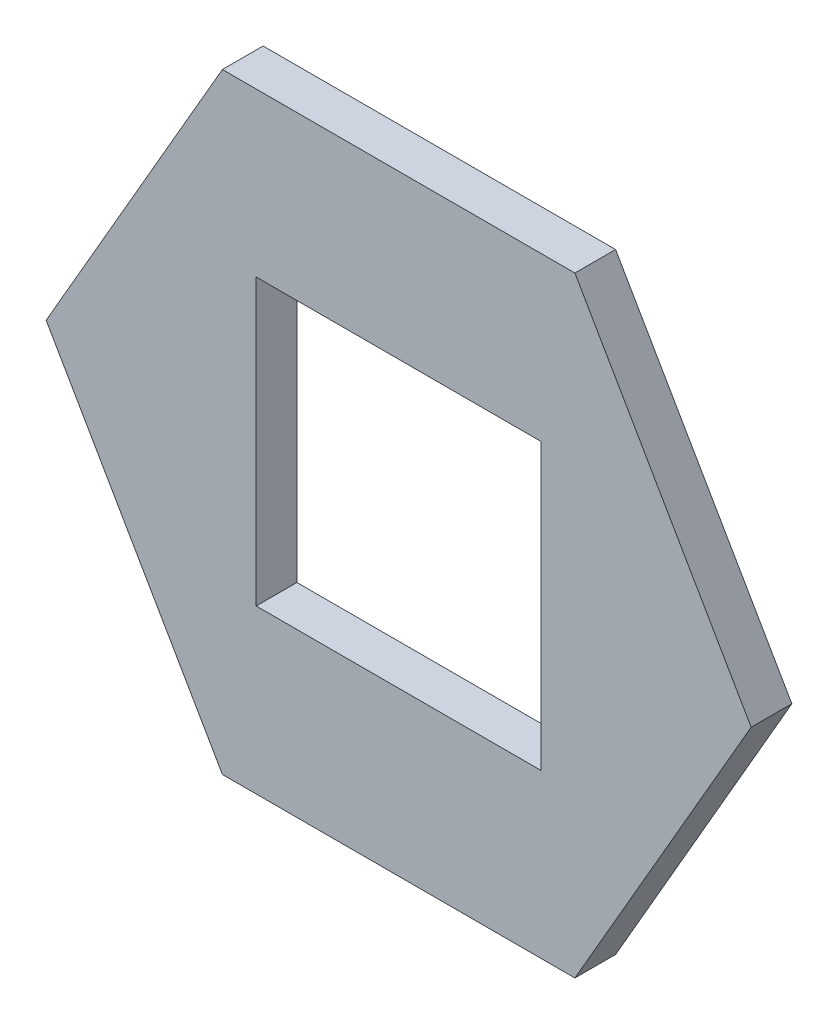
ISO-10303-21;
HEADER;
FILE_DESCRIPTION(('STEP AP214'),'2;1');
FILE_NAME('part.step','',(''),(''),'','','');
FILE_SCHEMA(('AUTOMOTIVE_DESIGN { 1 0 10303 214 1 1 1 1 }'));
ENDSEC;
DATA;
#1=APPLICATION_CONTEXT('core data for automotive mechanical design processes');
#2=APPLICATION_PROTOCOL_DEFINITION('international standard','automotive_design',2000,#1);
#3=PRODUCT_CONTEXT('',#1,'mechanical');
#4=PRODUCT('Part','Part','',(#3));
#5=PRODUCT_RELATED_PRODUCT_CATEGORY('part','',(#4));
#6=PRODUCT_DEFINITION_FORMATION('','',#4);
#7=PRODUCT_DEFINITION_CONTEXT('part definition',#1,'design');
#8=PRODUCT_DEFINITION('design','',#6,#7);
#9=PRODUCT_DEFINITION_SHAPE('','',#8);
#10=(LENGTH_UNIT() NAMED_UNIT(*) SI_UNIT(.MILLI.,.METRE.));
#11=(NAMED_UNIT(*) PLANE_ANGLE_UNIT() SI_UNIT($,.RADIAN.));
#12=(NAMED_UNIT(*) SI_UNIT($,.STERADIAN.) SOLID_ANGLE_UNIT());
#13=UNCERTAINTY_MEASURE_WITH_UNIT(LENGTH_MEASURE(1.E-05),#10,'distance_accuracy_value','');
#14=(GEOMETRIC_REPRESENTATION_CONTEXT(3) GLOBAL_UNCERTAINTY_ASSIGNED_CONTEXT((#13)) GLOBAL_UNIT_ASSIGNED_CONTEXT((#10,
#11,#12)) REPRESENTATION_CONTEXT('',''));
#15=CARTESIAN_POINT('',(0.,0.,0.));
#16=DIRECTION('',(0.,0.,1.));
#17=DIRECTION('',(1.,0.,0.));
#18=AXIS2_PLACEMENT_3D('',#15,#16,#17);
#19=CARTESIAN_POINT('',(43.3012701892221,-74.9999999999995,10.));
#20=DIRECTION('',(-0.866025403784441,0.499999999999996,0.));
#21=DIRECTION('',(-0.499999999999996,-0.866025403784441,0.));
#22=AXIS2_PLACEMENT_3D('',#19,#20,#21);
#23=PLANE('',#22);
#24=DIRECTION('',(0.499999999999996,0.866025403784441,0.));
#25=VECTOR('',#24,1.);
#26=CARTESIAN_POINT('',(43.3012701892221,-74.9999999999995,0.));
#27=LINE('',#26,#25);
#28=CARTESIAN_POINT('',(43.3012701892221,-74.9999999999995,0.));
#29=VERTEX_POINT('',#28);
#30=CARTESIAN_POINT('',(86.6025403784436,4.44645680446325E-13,0.));
#31=VERTEX_POINT('',#30);
#32=EDGE_CURVE('E147',#29,#31,#27,.T.);
#33=ORIENTED_EDGE('',*,*,#32,.T.);
#34=DIRECTION('',(0.,0.,-1.));
#35=VECTOR('',#34,1.);
#36=CARTESIAN_POINT('',(86.6025403784436,4.44645680446325E-13,10.));
#37=LINE('',#36,#35);
#38=CARTESIAN_POINT('',(86.6025403784436,4.44645680446325E-13,10.));
#39=VERTEX_POINT('',#38);
#40=EDGE_CURVE('E11',#39,#31,#37,.T.);
#41=ORIENTED_EDGE('',*,*,#40,.F.);
#42=DIRECTION('',(0.499999999999996,0.866025403784441,0.));
#43=VECTOR('',#42,1.);
#44=CARTESIAN_POINT('',(43.3012701892221,-74.9999999999995,10.));
#45=LINE('',#44,#43);
#46=CARTESIAN_POINT('',(43.3012701892221,-74.9999999999995,10.));
#47=VERTEX_POINT('',#46);
#48=EDGE_CURVE('E153',#47,#39,#45,.T.);
#49=ORIENTED_EDGE('',*,*,#48,.F.);
#50=DIRECTION('',(0.,0.,-1.));
#51=VECTOR('',#50,1.);
#52=CARTESIAN_POINT('',(43.3012701892221,-74.9999999999995,10.));
#53=LINE('',#52,#51);
#54=EDGE_CURVE('E169',#47,#29,#53,.T.);
#55=ORIENTED_EDGE('',*,*,#54,.T.);
#56=EDGE_LOOP('',(#33,#41,#49,#55));
#57=FACE_BOUND('',#56,.T.);
#58=ADVANCED_FACE('F35',(#57),#23,.F.);
#59=CARTESIAN_POINT('',(86.6025403784436,4.44645680446325E-13,10.));
#60=DIRECTION('',(-0.866025403784436,-0.500000000000004,0.));
#61=DIRECTION('',(0.500000000000004,-0.866025403784436,0.));
#62=AXIS2_PLACEMENT_3D('',#59,#60,#61);
#63=PLANE('',#62);
#64=DIRECTION('',(-0.500000000000004,0.866025403784436,0.));
#65=VECTOR('',#64,1.);
#66=CARTESIAN_POINT('',(86.6025403784436,4.44645680446325E-13,0.));
#67=LINE('',#66,#65);
#68=CARTESIAN_POINT('',(43.3012701892214,74.9999999999999,0.));
#69=VERTEX_POINT('',#68);
#70=EDGE_CURVE('E172',#31,#69,#67,.T.);
#71=ORIENTED_EDGE('',*,*,#70,.T.);
#72=DIRECTION('',(0.,0.,-1.));
#73=VECTOR('',#72,1.);
#74=CARTESIAN_POINT('',(43.3012701892214,74.9999999999999,10.));
#75=LINE('',#74,#73);
#76=CARTESIAN_POINT('',(43.3012701892214,74.9999999999999,10.));
#77=VERTEX_POINT('',#76);
#78=EDGE_CURVE('E42',#77,#69,#75,.T.);
#79=ORIENTED_EDGE('',*,*,#78,.F.);
#80=DIRECTION('',(-0.500000000000004,0.866025403784436,0.));
#81=VECTOR('',#80,1.);
#82=CARTESIAN_POINT('',(86.6025403784436,4.44645680446325E-13,10.));
#83=LINE('',#82,#81);
#84=EDGE_CURVE('E156',#39,#77,#83,.T.);
#85=ORIENTED_EDGE('',*,*,#84,.F.);
#86=ORIENTED_EDGE('',*,*,#40,.T.);
#87=EDGE_LOOP('',(#71,#79,#85,#86));
#88=FACE_BOUND('',#87,.T.);
#89=ADVANCED_FACE('F220',(#88),#63,.F.);
#90=CARTESIAN_POINT('',(43.3012701892214,74.9999999999999,10.));
#91=DIRECTION('',(0.,-1.,0.));
#92=DIRECTION('',(1.,0.,0.));
#93=AXIS2_PLACEMENT_3D('',#90,#91,#92);
#94=PLANE('',#93);
#95=DIRECTION('',(-1.,0.,0.));
#96=VECTOR('',#95,1.);
#97=CARTESIAN_POINT('',(43.3012701892214,74.9999999999999,0.));
#98=LINE('',#97,#96);
#99=CARTESIAN_POINT('',(-43.3012701892221,74.9999999999995,0.));
#100=VERTEX_POINT('',#99);
#101=EDGE_CURVE('E174',#69,#100,#98,.T.);
#102=ORIENTED_EDGE('',*,*,#101,.T.);
#103=DIRECTION('',(0.,0.,-1.));
#104=VECTOR('',#103,1.);
#105=CARTESIAN_POINT('',(-43.3012701892221,74.9999999999995,10.));
#106=LINE('',#105,#104);
#107=CARTESIAN_POINT('',(-43.3012701892221,74.9999999999995,10.));
#108=VERTEX_POINT('',#107);
#109=EDGE_CURVE('E192',#108,#100,#106,.T.);
#110=ORIENTED_EDGE('',*,*,#109,.F.);
#111=DIRECTION('',(-1.,0.,0.));
#112=VECTOR('',#111,1.);
#113=CARTESIAN_POINT('',(43.3012701892214,74.9999999999999,10.));
#114=LINE('',#113,#112);
#115=EDGE_CURVE('E159',#77,#108,#114,.T.);
#116=ORIENTED_EDGE('',*,*,#115,.F.);
#117=ORIENTED_EDGE('',*,*,#78,.T.);
#118=EDGE_LOOP('',(#102,#110,#116,#117));
#119=FACE_BOUND('',#118,.T.);
#120=ADVANCED_FACE('F199',(#119),#94,.F.);
#121=CARTESIAN_POINT('',(-43.3012701892221,74.9999999999995,10.));
#122=DIRECTION('',(0.866025403784441,-0.499999999999996,0.));
#123=DIRECTION('',(0.499999999999996,0.866025403784441,0.));
#124=AXIS2_PLACEMENT_3D('',#121,#122,#123);
#125=PLANE('',#124);
#126=DIRECTION('',(-0.499999999999996,-0.866025403784441,0.));
#127=VECTOR('',#126,1.);
#128=CARTESIAN_POINT('',(-43.3012701892221,74.9999999999995,0.));
#129=LINE('',#128,#127);
#130=CARTESIAN_POINT('',(-86.6025403784435,-4.32144893004261E-13,0.));
#131=VERTEX_POINT('',#130);
#132=EDGE_CURVE('E176',#100,#131,#129,.T.);
#133=ORIENTED_EDGE('',*,*,#132,.T.);
#134=DIRECTION('',(0.,0.,-1.));
#135=VECTOR('',#134,1.);
#136=CARTESIAN_POINT('',(-86.6025403784435,-4.32144893004261E-13,10.));
#137=LINE('',#136,#135);
#138=CARTESIAN_POINT('',(-86.6025403784435,-4.32144893004261E-13,10.));
#139=VERTEX_POINT('',#138);
#140=EDGE_CURVE('E189',#139,#131,#137,.T.);
#141=ORIENTED_EDGE('',*,*,#140,.F.);
#142=DIRECTION('',(-0.499999999999996,-0.866025403784441,0.));
#143=VECTOR('',#142,1.);
#144=CARTESIAN_POINT('',(-43.3012701892221,74.9999999999995,10.));
#145=LINE('',#144,#143);
#146=EDGE_CURVE('E162',#108,#139,#145,.T.);
#147=ORIENTED_EDGE('',*,*,#146,.F.);
#148=ORIENTED_EDGE('',*,*,#109,.T.);
#149=EDGE_LOOP('',(#133,#141,#147,#148));
#150=FACE_BOUND('',#149,.T.);
#151=ADVANCED_FACE('F208',(#150),#125,.F.);
#152=CARTESIAN_POINT('',(-86.6025403784435,-4.32144893004261E-13,10.));
#153=DIRECTION('',(0.866025403784436,0.500000000000004,0.));
#154=DIRECTION('',(-0.500000000000004,0.866025403784436,0.));
#155=AXIS2_PLACEMENT_3D('',#152,#153,#154);
#156=PLANE('',#155);
#157=DIRECTION('',(0.500000000000004,-0.866025403784436,0.));
#158=VECTOR('',#157,1.);
#159=CARTESIAN_POINT('',(-86.6025403784435,-4.32144893004261E-13,0.));
#160=LINE('',#159,#158);
#161=CARTESIAN_POINT('',(-43.3012701892214,-74.9999999999999,0.));
#162=VERTEX_POINT('',#161);
#163=EDGE_CURVE('E178',#131,#162,#160,.T.);
#164=ORIENTED_EDGE('',*,*,#163,.T.);
#165=DIRECTION('',(0.,0.,-1.));
#166=VECTOR('',#165,1.);
#167=CARTESIAN_POINT('',(-43.3012701892214,-74.9999999999999,10.));
#168=LINE('',#167,#166);
#169=CARTESIAN_POINT('',(-43.3012701892214,-74.9999999999999,10.));
#170=VERTEX_POINT('',#169);
#171=EDGE_CURVE('E185',#170,#162,#168,.T.);
#172=ORIENTED_EDGE('',*,*,#171,.F.);
#173=DIRECTION('',(0.500000000000004,-0.866025403784436,0.));
#174=VECTOR('',#173,1.);
#175=CARTESIAN_POINT('',(-86.6025403784435,-4.32144893004261E-13,10.));
#176=LINE('',#175,#174);
#177=EDGE_CURVE('E164',#139,#170,#176,.T.);
#178=ORIENTED_EDGE('',*,*,#177,.F.);
#179=ORIENTED_EDGE('',*,*,#140,.T.);
#180=EDGE_LOOP('',(#164,#172,#178,#179));
#181=FACE_BOUND('',#180,.T.);
#182=ADVANCED_FACE('F212',(#181),#156,.F.);
#183=CARTESIAN_POINT('',(-43.3012701892214,-74.9999999999999,10.));
#184=DIRECTION('',(0.,1.,0.));
#185=DIRECTION('',(-1.,0.,0.));
#186=AXIS2_PLACEMENT_3D('',#183,#184,#185);
#187=PLANE('',#186);
#188=DIRECTION('',(1.,0.,0.));
#189=VECTOR('',#188,1.);
#190=CARTESIAN_POINT('',(-43.3012701892214,-74.9999999999999,0.));
#191=LINE('',#190,#189);
#192=EDGE_CURVE('E157',#162,#29,#191,.T.);
#193=ORIENTED_EDGE('',*,*,#192,.T.);
#194=ORIENTED_EDGE('',*,*,#54,.F.);
#195=DIRECTION('',(1.,0.,0.));
#196=VECTOR('',#195,1.);
#197=CARTESIAN_POINT('',(-43.3012701892214,-74.9999999999999,10.));
#198=LINE('',#197,#196);
#199=EDGE_CURVE('E166',#170,#47,#198,.T.);
#200=ORIENTED_EDGE('',*,*,#199,.F.);
#201=ORIENTED_EDGE('',*,*,#171,.T.);
#202=EDGE_LOOP('',(#193,#194,#200,#201));
#203=FACE_BOUND('',#202,.T.);
#204=ADVANCED_FACE('F223',(#203),#187,.F.);
#205=CARTESIAN_POINT('',(0.,0.,10.));
#206=DIRECTION('',(0.,0.,1.));
#207=DIRECTION('',(1.,0.,0.));
#208=AXIS2_PLACEMENT_3D('',#205,#206,#207);
#209=PLANE('',#208);
#210=DIRECTION('',(0.,1.,0.));
#211=VECTOR('',#210,1.);
#212=CARTESIAN_POINT('',(34.9999999999998,-35.0000000000006,10.));
#213=LINE('',#212,#211);
#214=CARTESIAN_POINT('',(34.9999999999998,-35.0000000000006,10.));
#215=VERTEX_POINT('',#214);
#216=CARTESIAN_POINT('',(35.0000000000002,34.9999999999994,10.));
#217=VERTEX_POINT('',#216);
#218=EDGE_CURVE('E49',#215,#217,#213,.T.);
#219=ORIENTED_EDGE('',*,*,#218,.F.);
#220=DIRECTION('',(1.,0.,0.));
#221=VECTOR('',#220,1.);
#222=CARTESIAN_POINT('',(-35.0000000000002,-35.0000000000003,10.));
#223=LINE('',#222,#221);
#224=CARTESIAN_POINT('',(-35.0000000000002,-35.0000000000003,10.));
#225=VERTEX_POINT('',#224);
#226=EDGE_CURVE('E129',#225,#215,#223,.T.);
#227=ORIENTED_EDGE('',*,*,#226,.F.);
#228=DIRECTION('',(0.,-1.,0.));
#229=VECTOR('',#228,1.);
#230=CARTESIAN_POINT('',(-35.0000000000002,-35.0000000000003,10.));
#231=LINE('',#230,#229);
#232=CARTESIAN_POINT('',(-34.9999999999998,34.9999999999997,10.));
#233=VERTEX_POINT('',#232);
#234=EDGE_CURVE('E133',#233,#225,#231,.T.);
#235=ORIENTED_EDGE('',*,*,#234,.F.);
#236=DIRECTION('',(-1.,0.,0.));
#237=VECTOR('',#236,1.);
#238=CARTESIAN_POINT('',(-34.9999999999998,34.9999999999997,10.));
#239=LINE('',#238,#237);
#240=EDGE_CURVE('E140',#217,#233,#239,.T.);
#241=ORIENTED_EDGE('',*,*,#240,.F.);
#242=EDGE_LOOP('',(#219,#227,#235,#241));
#243=FACE_BOUND('',#242,.T.);
#244=ORIENTED_EDGE('',*,*,#48,.T.);
#245=ORIENTED_EDGE('',*,*,#84,.T.);
#246=ORIENTED_EDGE('',*,*,#115,.T.);
#247=ORIENTED_EDGE('',*,*,#146,.T.);
#248=ORIENTED_EDGE('',*,*,#177,.T.);
#249=ORIENTED_EDGE('',*,*,#199,.T.);
#250=EDGE_LOOP('',(#244,#245,#246,#247,#248,#249));
#251=FACE_BOUND('',#250,.T.);
#252=ADVANCED_FACE('F216',(#243,#251),#209,.T.);
#253=CARTESIAN_POINT('',(0.,0.,0.));
#254=DIRECTION('',(0.,0.,1.));
#255=DIRECTION('',(1.,0.,0.));
#256=AXIS2_PLACEMENT_3D('',#253,#254,#255);
#257=PLANE('',#256);
#258=DIRECTION('',(1.,0.,0.));
#259=VECTOR('',#258,1.);
#260=CARTESIAN_POINT('',(-35.0000000000002,-35.0000000000003,0.));
#261=LINE('',#260,#259);
#262=CARTESIAN_POINT('',(-35.0000000000002,-35.0000000000003,0.));
#263=VERTEX_POINT('',#262);
#264=CARTESIAN_POINT('',(34.9999999999998,-35.0000000000006,0.));
#265=VERTEX_POINT('',#264);
#266=EDGE_CURVE('E119',#263,#265,#261,.T.);
#267=ORIENTED_EDGE('',*,*,#266,.T.);
#268=DIRECTION('',(0.,1.,0.));
#269=VECTOR('',#268,1.);
#270=CARTESIAN_POINT('',(34.9999999999998,-35.0000000000006,0.));
#271=LINE('',#270,#269);
#272=CARTESIAN_POINT('',(35.0000000000002,34.9999999999994,0.));
#273=VERTEX_POINT('',#272);
#274=EDGE_CURVE('E113',#265,#273,#271,.T.);
#275=ORIENTED_EDGE('',*,*,#274,.T.);
#276=DIRECTION('',(-1.,0.,0.));
#277=VECTOR('',#276,1.);
#278=CARTESIAN_POINT('',(-34.9999999999998,34.9999999999997,0.));
#279=LINE('',#278,#277);
#280=CARTESIAN_POINT('',(-34.9999999999998,34.9999999999997,0.));
#281=VERTEX_POINT('',#280);
#282=EDGE_CURVE('E122',#273,#281,#279,.T.);
#283=ORIENTED_EDGE('',*,*,#282,.T.);
#284=DIRECTION('',(0.,-1.,0.));
#285=VECTOR('',#284,1.);
#286=CARTESIAN_POINT('',(-35.0000000000002,-35.0000000000003,0.));
#287=LINE('',#286,#285);
#288=EDGE_CURVE('E57',#281,#263,#287,.T.);
#289=ORIENTED_EDGE('',*,*,#288,.T.);
#290=EDGE_LOOP('',(#267,#275,#283,#289));
#291=FACE_BOUND('',#290,.T.);
#292=ORIENTED_EDGE('',*,*,#32,.F.);
#293=ORIENTED_EDGE('',*,*,#192,.F.);
#294=ORIENTED_EDGE('',*,*,#163,.F.);
#295=ORIENTED_EDGE('',*,*,#132,.F.);
#296=ORIENTED_EDGE('',*,*,#101,.F.);
#297=ORIENTED_EDGE('',*,*,#70,.F.);
#298=EDGE_LOOP('',(#292,#293,#294,#295,#296,#297));
#299=FACE_BOUND('',#298,.T.);
#300=ADVANCED_FACE('F126',(#291,#299),#257,.F.);
#301=CARTESIAN_POINT('',(34.9999999999998,-35.0000000000006,0.));
#302=DIRECTION('',(1.,0.,0.));
#303=DIRECTION('',(0.,1.,0.));
#304=AXIS2_PLACEMENT_3D('',#301,#302,#303);
#305=PLANE('',#304);
#306=ORIENTED_EDGE('',*,*,#218,.T.);
#307=DIRECTION('',(0.,0.,1.));
#308=VECTOR('',#307,1.);
#309=CARTESIAN_POINT('',(35.0000000000002,34.9999999999994,0.));
#310=LINE('',#309,#308);
#311=EDGE_CURVE('E109',#273,#217,#310,.T.);
#312=ORIENTED_EDGE('',*,*,#311,.F.);
#313=ORIENTED_EDGE('',*,*,#274,.F.);
#314=DIRECTION('',(0.,0.,1.));
#315=VECTOR('',#314,1.);
#316=CARTESIAN_POINT('',(34.9999999999998,-35.0000000000006,0.));
#317=LINE('',#316,#315);
#318=EDGE_CURVE('E145',#265,#215,#317,.T.);
#319=ORIENTED_EDGE('',*,*,#318,.T.);
#320=EDGE_LOOP('',(#306,#312,#313,#319));
#321=FACE_BOUND('',#320,.T.);
#322=ADVANCED_FACE('F111',(#321),#305,.F.);
#323=CARTESIAN_POINT('',(-35.0000000000002,-35.0000000000003,0.));
#324=DIRECTION('',(0.,-1.,0.));
#325=DIRECTION('',(1.,0.,0.));
#326=AXIS2_PLACEMENT_3D('',#323,#324,#325);
#327=PLANE('',#326);
#328=ORIENTED_EDGE('',*,*,#226,.T.);
#329=ORIENTED_EDGE('',*,*,#318,.F.);
#330=ORIENTED_EDGE('',*,*,#266,.F.);
#331=DIRECTION('',(0.,0.,1.));
#332=VECTOR('',#331,1.);
#333=CARTESIAN_POINT('',(-35.0000000000002,-35.0000000000003,0.));
#334=LINE('',#333,#332);
#335=EDGE_CURVE('E148',#263,#225,#334,.T.);
#336=ORIENTED_EDGE('',*,*,#335,.T.);
#337=EDGE_LOOP('',(#328,#329,#330,#336));
#338=FACE_BOUND('',#337,.T.);
#339=ADVANCED_FACE('F278',(#338),#327,.F.);
#340=CARTESIAN_POINT('',(-35.0000000000002,-35.0000000000003,0.));
#341=DIRECTION('',(-1.,0.,0.));
#342=DIRECTION('',(0.,-1.,0.));
#343=AXIS2_PLACEMENT_3D('',#340,#341,#342);
#344=PLANE('',#343);
#345=ORIENTED_EDGE('',*,*,#234,.T.);
#346=ORIENTED_EDGE('',*,*,#335,.F.);
#347=ORIENTED_EDGE('',*,*,#288,.F.);
#348=DIRECTION('',(0.,0.,1.));
#349=VECTOR('',#348,1.);
#350=CARTESIAN_POINT('',(-34.9999999999998,34.9999999999997,0.));
#351=LINE('',#350,#349);
#352=EDGE_CURVE('E118',#281,#233,#351,.T.);
#353=ORIENTED_EDGE('',*,*,#352,.T.);
#354=EDGE_LOOP('',(#345,#346,#347,#353));
#355=FACE_BOUND('',#354,.T.);
#356=ADVANCED_FACE('F287',(#355),#344,.F.);
#357=CARTESIAN_POINT('',(-34.9999999999998,34.9999999999997,0.));
#358=DIRECTION('',(0.,1.,0.));
#359=DIRECTION('',(-1.,0.,0.));
#360=AXIS2_PLACEMENT_3D('',#357,#358,#359);
#361=PLANE('',#360);
#362=ORIENTED_EDGE('',*,*,#240,.T.);
#363=ORIENTED_EDGE('',*,*,#352,.F.);
#364=ORIENTED_EDGE('',*,*,#282,.F.);
#365=ORIENTED_EDGE('',*,*,#311,.T.);
#366=EDGE_LOOP('',(#362,#363,#364,#365));
#367=FACE_BOUND('',#366,.T.);
#368=ADVANCED_FACE('F123',(#367),#361,.F.);
#369=CLOSED_SHELL('',(#58,#89,#120,#151,#182,#204,#252,#300,#322,#339,#356,#368));
#370=MANIFOLD_SOLID_BREP('B2',#369);
#371=ADVANCED_BREP_SHAPE_REPRESENTATION('',(#18,#370),#14);
#372=SHAPE_DEFINITION_REPRESENTATION(#9,#371);
ENDSEC;
END-ISO-10303-21;
